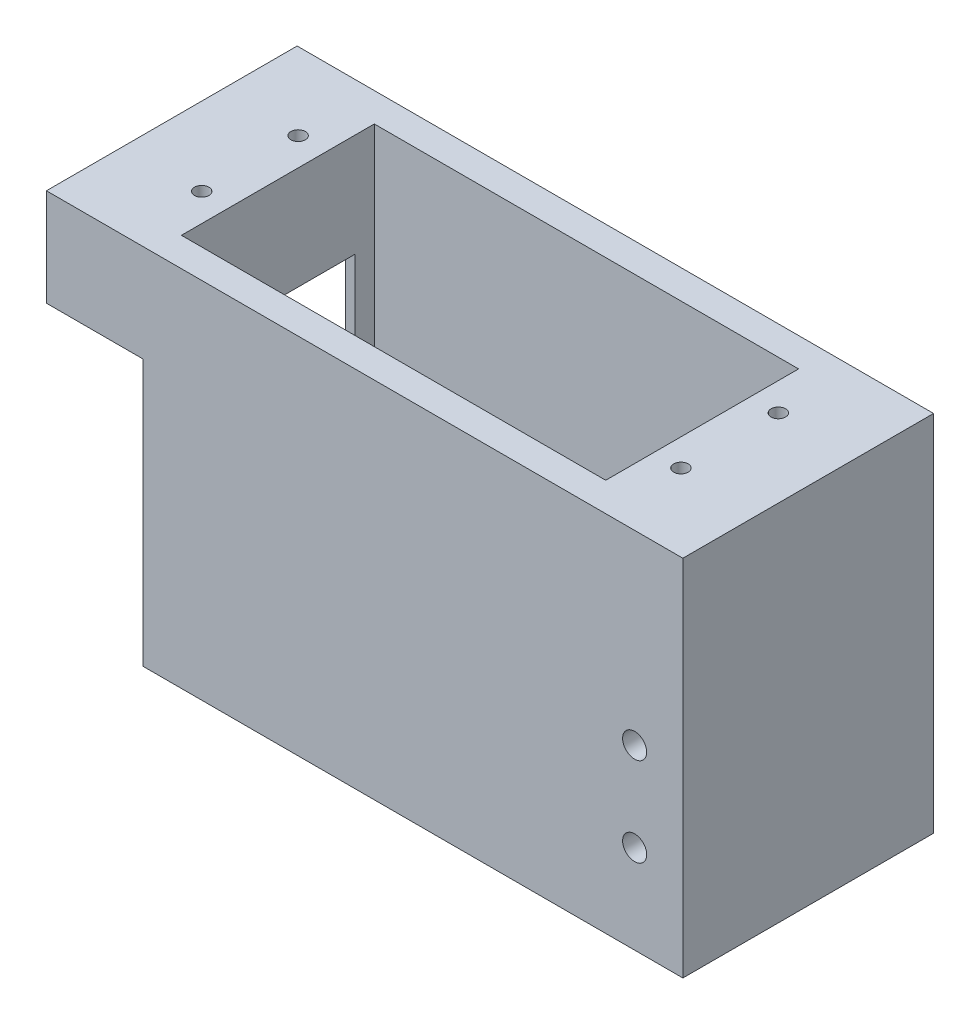
ISO-10303-21;
HEADER;
FILE_DESCRIPTION(('STEP AP214'),'2;1');
FILE_NAME('part.step','',(''),(''),'','','');
FILE_SCHEMA(('AUTOMOTIVE_DESIGN { 1 0 10303 214 1 1 1 1 }'));
ENDSEC;
DATA;
#1=APPLICATION_CONTEXT('core data for automotive mechanical design processes');
#2=APPLICATION_PROTOCOL_DEFINITION('international standard','automotive_design',2000,#1);
#3=PRODUCT_CONTEXT('',#1,'mechanical');
#4=PRODUCT('Part','Part','',(#3));
#5=PRODUCT_RELATED_PRODUCT_CATEGORY('part','',(#4));
#6=PRODUCT_DEFINITION_FORMATION('','',#4);
#7=PRODUCT_DEFINITION_CONTEXT('part definition',#1,'design');
#8=PRODUCT_DEFINITION('design','',#6,#7);
#9=PRODUCT_DEFINITION_SHAPE('','',#8);
#10=(LENGTH_UNIT() NAMED_UNIT(*) SI_UNIT(.MILLI.,.METRE.));
#11=(NAMED_UNIT(*) PLANE_ANGLE_UNIT() SI_UNIT($,.RADIAN.));
#12=(NAMED_UNIT(*) SI_UNIT($,.STERADIAN.) SOLID_ANGLE_UNIT());
#13=UNCERTAINTY_MEASURE_WITH_UNIT(LENGTH_MEASURE(1.E-05),#10,'distance_accuracy_value','');
#14=(GEOMETRIC_REPRESENTATION_CONTEXT(3) GLOBAL_UNCERTAINTY_ASSIGNED_CONTEXT((#13)) GLOBAL_UNIT_ASSIGNED_CONTEXT((#10,
#11,#12)) REPRESENTATION_CONTEXT('',''));
#15=CARTESIAN_POINT('',(0.,0.,0.));
#16=DIRECTION('',(0.,0.,1.));
#17=DIRECTION('',(1.,0.,0.));
#18=AXIS2_PLACEMENT_3D('',#15,#16,#17);
#19=CARTESIAN_POINT('',(0.,27.6,0.));
#20=DIRECTION('',(1.,0.,0.));
#21=DIRECTION('',(0.,0.,-1.));
#22=AXIS2_PLACEMENT_3D('',#19,#20,#21);
#23=PLANE('',#22);
#24=DIRECTION('',(0.,0.,1.));
#25=VECTOR('',#24,1.);
#26=CARTESIAN_POINT('',(0.,12.,-21.));
#27=LINE('',#26,#25);
#28=CARTESIAN_POINT('',(0.,12.,-21.));
#29=VERTEX_POINT('',#28);
#30=CARTESIAN_POINT('',(0.,12.,-5.));
#31=VERTEX_POINT('',#30);
#32=EDGE_CURVE('E239',#29,#31,#27,.T.);
#33=ORIENTED_EDGE('',*,*,#32,.F.);
#34=DIRECTION('',(0.,-1.,0.));
#35=VECTOR('',#34,1.);
#36=CARTESIAN_POINT('',(0.,27.,-21.));
#37=LINE('',#36,#35);
#38=CARTESIAN_POINT('',(0.,27.,-21.));
#39=VERTEX_POINT('',#38);
#40=EDGE_CURVE('E282',#39,#29,#37,.T.);
#41=ORIENTED_EDGE('',*,*,#40,.F.);
#42=DIRECTION('',(0.,0.,1.));
#43=VECTOR('',#42,1.);
#44=CARTESIAN_POINT('',(0.,27.,-21.));
#45=LINE('',#44,#43);
#46=CARTESIAN_POINT('',(0.,27.,-5.));
#47=VERTEX_POINT('',#46);
#48=EDGE_CURVE('E284',#39,#47,#45,.T.);
#49=ORIENTED_EDGE('',*,*,#48,.T.);
#50=DIRECTION('',(0.,-1.,0.));
#51=VECTOR('',#50,1.);
#52=CARTESIAN_POINT('',(0.,27.,-5.));
#53=LINE('',#52,#51);
#54=EDGE_CURVE('E291',#47,#31,#53,.T.);
#55=ORIENTED_EDGE('',*,*,#54,.T.);
#56=EDGE_LOOP('',(#33,#41,#49,#55));
#57=FACE_BOUND('',#56,.T.);
#58=DIRECTION('',(0.,0.,1.));
#59=VECTOR('',#58,1.);
#60=CARTESIAN_POINT('',(0.,0.,0.));
#61=LINE('',#60,#59);
#62=CARTESIAN_POINT('',(0.,0.,-26.));
#63=VERTEX_POINT('',#62);
#64=CARTESIAN_POINT('',(0.,0.,0.));
#65=VERTEX_POINT('',#64);
#66=EDGE_CURVE('E243',#63,#65,#61,.T.);
#67=ORIENTED_EDGE('',*,*,#66,.T.);
#68=DIRECTION('',(0.,-1.,0.));
#69=VECTOR('',#68,1.);
#70=CARTESIAN_POINT('',(0.,27.6,0.));
#71=LINE('',#70,#69);
#72=CARTESIAN_POINT('',(0.,27.6,0.));
#73=VERTEX_POINT('',#72);
#74=EDGE_CURVE('E246',#73,#65,#71,.T.);
#75=ORIENTED_EDGE('',*,*,#74,.F.);
#76=DIRECTION('',(0.,0.,1.));
#77=VECTOR('',#76,1.);
#78=CARTESIAN_POINT('',(0.,27.6,0.));
#79=LINE('',#78,#77);
#80=CARTESIAN_POINT('',(0.,27.6,-26.));
#81=VERTEX_POINT('',#80);
#82=EDGE_CURVE('E262',#81,#73,#79,.T.);
#83=ORIENTED_EDGE('',*,*,#82,.F.);
#84=DIRECTION('',(0.,-1.,0.));
#85=VECTOR('',#84,1.);
#86=CARTESIAN_POINT('',(0.,27.6,-26.));
#87=LINE('',#86,#85);
#88=EDGE_CURVE('E248',#81,#63,#87,.T.);
#89=ORIENTED_EDGE('',*,*,#88,.T.);
#90=EDGE_LOOP('',(#67,#75,#83,#89));
#91=FACE_BOUND('',#90,.T.);
#92=ADVANCED_FACE('F45',(#57,#91),#23,.F.);
#93=CARTESIAN_POINT('',(0.,27.6,0.));
#94=DIRECTION('',(0.,0.,-1.));
#95=DIRECTION('',(-1.,0.,0.));
#96=AXIS2_PLACEMENT_3D('',#93,#94,#95);
#97=PLANE('',#96);
#98=CARTESIAN_POINT('',(51.,18.4,0.));
#99=DIRECTION('',(0.,0.,1.));
#100=DIRECTION('',(1.,0.,0.));
#101=AXIS2_PLACEMENT_3D('',#98,#99,#100);
#102=CIRCLE('',#101,1.24999999999999);
#103=CARTESIAN_POINT('',(52.25,18.4,0.));
#104=VERTEX_POINT('',#103);
#105=EDGE_CURVE('E186',#104,#104,#102,.T.);
#106=ORIENTED_EDGE('',*,*,#105,.F.);
#107=EDGE_LOOP('',(#106));
#108=FACE_BOUND('',#107,.T.);
#109=CARTESIAN_POINT('',(51.,9.2,0.));
#110=DIRECTION('',(0.,0.,1.));
#111=DIRECTION('',(1.,0.,0.));
#112=AXIS2_PLACEMENT_3D('',#109,#110,#111);
#113=CIRCLE('',#112,1.24999999999999);
#114=CARTESIAN_POINT('',(52.25,9.2,0.));
#115=VERTEX_POINT('',#114);
#116=EDGE_CURVE('E392',#115,#115,#113,.T.);
#117=ORIENTED_EDGE('',*,*,#116,.F.);
#118=EDGE_LOOP('',(#117));
#119=FACE_BOUND('',#118,.T.);
#120=DIRECTION('',(1.,0.,0.));
#121=VECTOR('',#120,1.);
#122=CARTESIAN_POINT('',(0.,0.,0.));
#123=LINE('',#122,#121);
#124=CARTESIAN_POINT('',(56.,0.,0.));
#125=VERTEX_POINT('',#124);
#126=EDGE_CURVE('E251',#65,#125,#123,.T.);
#127=ORIENTED_EDGE('',*,*,#126,.T.);
#128=DIRECTION('',(0.,-1.,0.));
#129=VECTOR('',#128,1.);
#130=CARTESIAN_POINT('',(56.,37.7,0.));
#131=LINE('',#130,#129);
#132=CARTESIAN_POINT('',(56.,37.7,0.));
#133=VERTEX_POINT('',#132);
#134=EDGE_CURVE('E259',#133,#125,#131,.T.);
#135=ORIENTED_EDGE('',*,*,#134,.F.);
#136=DIRECTION('',(1.,0.,0.));
#137=VECTOR('',#136,1.);
#138=CARTESIAN_POINT('',(-10.,37.7,0.));
#139=LINE('',#138,#137);
#140=CARTESIAN_POINT('',(-10.,37.7,0.));
#141=VERTEX_POINT('',#140);
#142=EDGE_CURVE('E345',#141,#133,#139,.T.);
#143=ORIENTED_EDGE('',*,*,#142,.F.);
#144=DIRECTION('',(0.,-1.,0.));
#145=VECTOR('',#144,1.);
#146=CARTESIAN_POINT('',(-10.,37.7,0.));
#147=LINE('',#146,#145);
#148=CARTESIAN_POINT('',(-10.,27.6,0.));
#149=VERTEX_POINT('',#148);
#150=EDGE_CURVE('E252',#141,#149,#147,.T.);
#151=ORIENTED_EDGE('',*,*,#150,.T.);
#152=DIRECTION('',(1.,0.,0.));
#153=VECTOR('',#152,1.);
#154=CARTESIAN_POINT('',(-10.,27.6,0.));
#155=LINE('',#154,#153);
#156=EDGE_CURVE('E359',#149,#73,#155,.T.);
#157=ORIENTED_EDGE('',*,*,#156,.T.);
#158=ORIENTED_EDGE('',*,*,#74,.T.);
#159=EDGE_LOOP('',(#127,#135,#143,#151,#157,#158));
#160=FACE_BOUND('',#159,.T.);
#161=ADVANCED_FACE('F225',(#108,#119,#160),#97,.F.);
#162=CARTESIAN_POINT('',(0.,27.6,-26.));
#163=DIRECTION('',(0.,0.,1.));
#164=DIRECTION('',(1.,0.,0.));
#165=AXIS2_PLACEMENT_3D('',#162,#163,#164);
#166=PLANE('',#165);
#167=CARTESIAN_POINT('',(51.,18.4,-26.));
#168=DIRECTION('',(0.,0.,1.));
#169=DIRECTION('',(1.,0.,0.));
#170=AXIS2_PLACEMENT_3D('',#167,#168,#169);
#171=CIRCLE('',#170,1.24999999999999);
#172=CARTESIAN_POINT('',(52.25,18.4,-26.));
#173=VERTEX_POINT('',#172);
#174=EDGE_CURVE('E543',#173,#173,#171,.T.);
#175=ORIENTED_EDGE('',*,*,#174,.T.);
#176=EDGE_LOOP('',(#175));
#177=FACE_BOUND('',#176,.T.);
#178=CARTESIAN_POINT('',(51.,9.2,-26.));
#179=DIRECTION('',(0.,0.,1.));
#180=DIRECTION('',(1.,0.,0.));
#181=AXIS2_PLACEMENT_3D('',#178,#179,#180);
#182=CIRCLE('',#181,1.24999999999999);
#183=CARTESIAN_POINT('',(52.25,9.2,-26.));
#184=VERTEX_POINT('',#183);
#185=EDGE_CURVE('E384',#184,#184,#182,.T.);
#186=ORIENTED_EDGE('',*,*,#185,.T.);
#187=EDGE_LOOP('',(#186));
#188=FACE_BOUND('',#187,.T.);
#189=DIRECTION('',(0.,-1.,0.));
#190=VECTOR('',#189,1.);
#191=CARTESIAN_POINT('',(56.,37.7,-26.));
#192=LINE('',#191,#190);
#193=CARTESIAN_POINT('',(56.,37.7,-26.));
#194=VERTEX_POINT('',#193);
#195=CARTESIAN_POINT('',(56.,0.,-26.));
#196=VERTEX_POINT('',#195);
#197=EDGE_CURVE('E367',#194,#196,#192,.T.);
#198=ORIENTED_EDGE('',*,*,#197,.T.);
#199=DIRECTION('',(-1.,0.,0.));
#200=VECTOR('',#199,1.);
#201=CARTESIAN_POINT('',(0.,0.,-26.));
#202=LINE('',#201,#200);
#203=EDGE_CURVE('E256',#196,#63,#202,.T.);
#204=ORIENTED_EDGE('',*,*,#203,.T.);
#205=ORIENTED_EDGE('',*,*,#88,.F.);
#206=DIRECTION('',(-1.,0.,0.));
#207=VECTOR('',#206,1.);
#208=CARTESIAN_POINT('',(-10.,27.6,-26.));
#209=LINE('',#208,#207);
#210=CARTESIAN_POINT('',(-10.,27.6,-26.));
#211=VERTEX_POINT('',#210);
#212=EDGE_CURVE('E346',#81,#211,#209,.T.);
#213=ORIENTED_EDGE('',*,*,#212,.T.);
#214=DIRECTION('',(0.,-1.,0.));
#215=VECTOR('',#214,1.);
#216=CARTESIAN_POINT('',(-10.,37.7,-26.));
#217=LINE('',#216,#215);
#218=CARTESIAN_POINT('',(-10.,37.7,-26.));
#219=VERTEX_POINT('',#218);
#220=EDGE_CURVE('E355',#219,#211,#217,.T.);
#221=ORIENTED_EDGE('',*,*,#220,.F.);
#222=DIRECTION('',(-1.,0.,0.));
#223=VECTOR('',#222,1.);
#224=CARTESIAN_POINT('',(-10.,37.7,-26.));
#225=LINE('',#224,#223);
#226=EDGE_CURVE('E352',#194,#219,#225,.T.);
#227=ORIENTED_EDGE('',*,*,#226,.F.);
#228=EDGE_LOOP('',(#198,#204,#205,#213,#221,#227));
#229=FACE_BOUND('',#228,.T.);
#230=ADVANCED_FACE('F232',(#177,#188,#229),#166,.F.);
#231=CARTESIAN_POINT('',(0.,0.,0.));
#232=DIRECTION('',(0.,-1.,0.));
#233=DIRECTION('',(0.,0.,-1.));
#234=AXIS2_PLACEMENT_3D('',#231,#232,#233);
#235=PLANE('',#234);
#236=CARTESIAN_POINT('',(51.,0.,-13.));
#237=DIRECTION('',(0.,-1.,0.));
#238=DIRECTION('',(0.,0.,-1.));
#239=AXIS2_PLACEMENT_3D('',#236,#237,#238);
#240=CIRCLE('',#239,1.24999999999999);
#241=CARTESIAN_POINT('',(51.,0.,-14.25));
#242=VERTEX_POINT('',#241);
#243=EDGE_CURVE('E565',#242,#242,#240,.T.);
#244=ORIENTED_EDGE('',*,*,#243,.F.);
#245=EDGE_LOOP('',(#244));
#246=FACE_BOUND('',#245,.T.);
#247=CARTESIAN_POINT('',(13.05,0.,-13.));
#248=DIRECTION('',(0.,-1.,0.));
#249=DIRECTION('',(0.,0.,-1.));
#250=AXIS2_PLACEMENT_3D('',#247,#248,#249);
#251=CIRCLE('',#250,10.9);
#252=CARTESIAN_POINT('',(13.05,0.,-23.9));
#253=VERTEX_POINT('',#252);
#254=EDGE_CURVE('E431',#253,#253,#251,.T.);
#255=ORIENTED_EDGE('',*,*,#254,.F.);
#256=EDGE_LOOP('',(#255));
#257=FACE_BOUND('',#256,.T.);
#258=ORIENTED_EDGE('',*,*,#66,.F.);
#259=ORIENTED_EDGE('',*,*,#203,.F.);
#260=DIRECTION('',(0.,0.,-1.));
#261=VECTOR('',#260,1.);
#262=CARTESIAN_POINT('',(56.,0.,0.));
#263=LINE('',#262,#261);
#264=EDGE_CURVE('E380',#125,#196,#263,.T.);
#265=ORIENTED_EDGE('',*,*,#264,.F.);
#266=ORIENTED_EDGE('',*,*,#126,.F.);
#267=EDGE_LOOP('',(#258,#259,#265,#266));
#268=FACE_BOUND('',#267,.T.);
#269=ADVANCED_FACE('F381',(#246,#257,#268),#235,.T.);
#270=CARTESIAN_POINT('',(0.,27.6,0.));
#271=DIRECTION('',(0.,1.,0.));
#272=DIRECTION('',(0.,0.,1.));
#273=AXIS2_PLACEMENT_3D('',#270,#271,#272);
#274=PLANE('',#273);
#275=ORIENTED_EDGE('',*,*,#212,.F.);
#276=ORIENTED_EDGE('',*,*,#82,.T.);
#277=ORIENTED_EDGE('',*,*,#156,.F.);
#278=DIRECTION('',(0.,0.,1.));
#279=VECTOR('',#278,1.);
#280=CARTESIAN_POINT('',(-10.,27.6,-26.));
#281=LINE('',#280,#279);
#282=EDGE_CURVE('E340',#211,#149,#281,.T.);
#283=ORIENTED_EDGE('',*,*,#282,.F.);
#284=EDGE_LOOP('',(#275,#276,#277,#283));
#285=FACE_BOUND('',#284,.T.);
#286=ADVANCED_FACE('F526',(#285),#274,.F.);
#287=CARTESIAN_POINT('',(-10.,37.7,-26.));
#288=DIRECTION('',(1.,0.,0.));
#289=DIRECTION('',(0.,0.,-1.));
#290=AXIS2_PLACEMENT_3D('',#287,#288,#289);
#291=PLANE('',#290);
#292=ORIENTED_EDGE('',*,*,#282,.T.);
#293=ORIENTED_EDGE('',*,*,#150,.F.);
#294=DIRECTION('',(0.,0.,1.));
#295=VECTOR('',#294,1.);
#296=CARTESIAN_POINT('',(-10.,37.7,-26.));
#297=LINE('',#296,#295);
#298=EDGE_CURVE('E341',#219,#141,#297,.T.);
#299=ORIENTED_EDGE('',*,*,#298,.F.);
#300=ORIENTED_EDGE('',*,*,#220,.T.);
#301=EDGE_LOOP('',(#292,#293,#299,#300));
#302=FACE_BOUND('',#301,.T.);
#303=ADVANCED_FACE('F529',(#302),#291,.F.);
#304=CARTESIAN_POINT('',(56.,37.7,-26.));
#305=DIRECTION('',(-1.,0.,0.));
#306=DIRECTION('',(0.,0.,1.));
#307=AXIS2_PLACEMENT_3D('',#304,#305,#306);
#308=PLANE('',#307);
#309=ORIENTED_EDGE('',*,*,#134,.T.);
#310=ORIENTED_EDGE('',*,*,#264,.T.);
#311=ORIENTED_EDGE('',*,*,#197,.F.);
#312=DIRECTION('',(0.,0.,-1.));
#313=VECTOR('',#312,1.);
#314=CARTESIAN_POINT('',(56.,37.7,-26.));
#315=LINE('',#314,#313);
#316=EDGE_CURVE('E349',#133,#194,#315,.T.);
#317=ORIENTED_EDGE('',*,*,#316,.F.);
#318=EDGE_LOOP('',(#309,#310,#311,#317));
#319=FACE_BOUND('',#318,.T.);
#320=ADVANCED_FACE('F378',(#319),#308,.F.);
#321=CARTESIAN_POINT('',(0.,37.7,0.));
#322=DIRECTION('',(0.,1.,0.));
#323=DIRECTION('',(0.,0.,1.));
#324=AXIS2_PLACEMENT_3D('',#321,#322,#323);
#325=PLANE('',#324);
#326=DIRECTION('',(0.,0.,1.));
#327=VECTOR('',#326,1.);
#328=CARTESIAN_POINT('',(0.999999999999993,37.7,-23.));
#329=LINE('',#328,#327);
#330=CARTESIAN_POINT('',(0.999999999999993,37.7,-23.));
#331=VERTEX_POINT('',#330);
#332=CARTESIAN_POINT('',(0.999999999999992,37.7,-2.99999999999999));
#333=VERTEX_POINT('',#332);
#334=EDGE_CURVE('E383',#331,#333,#329,.T.);
#335=ORIENTED_EDGE('',*,*,#334,.F.);
#336=DIRECTION('',(-1.,0.,0.));
#337=VECTOR('',#336,1.);
#338=CARTESIAN_POINT('',(43.,37.7,-23.));
#339=LINE('',#338,#337);
#340=CARTESIAN_POINT('',(45.,37.7,-23.));
#341=VERTEX_POINT('',#340);
#342=EDGE_CURVE('E334',#341,#331,#339,.T.);
#343=ORIENTED_EDGE('',*,*,#342,.F.);
#344=DIRECTION('',(0.,0.,-1.));
#345=VECTOR('',#344,1.);
#346=CARTESIAN_POINT('',(45.,37.7,-23.));
#347=LINE('',#346,#345);
#348=CARTESIAN_POINT('',(45.,37.7,-2.99999999999999));
#349=VERTEX_POINT('',#348);
#350=EDGE_CURVE('E389',#349,#341,#347,.T.);
#351=ORIENTED_EDGE('',*,*,#350,.F.);
#352=DIRECTION('',(-1.,0.,0.));
#353=VECTOR('',#352,1.);
#354=CARTESIAN_POINT('',(43.,37.7,-3.));
#355=LINE('',#354,#353);
#356=EDGE_CURVE('E337',#349,#333,#355,.T.);
#357=ORIENTED_EDGE('',*,*,#356,.T.);
#358=EDGE_LOOP('',(#335,#343,#351,#357));
#359=FACE_BOUND('',#358,.T.);
#360=CARTESIAN_POINT('',(-1.90000000000001,37.7,-18.));
#361=DIRECTION('',(0.,1.,0.));
#362=DIRECTION('',(0.,0.,1.));
#363=AXIS2_PLACEMENT_3D('',#360,#361,#362);
#364=CIRCLE('',#363,0.749999999999989);
#365=CARTESIAN_POINT('',(-1.90000000000001,37.7,-17.25));
#366=VERTEX_POINT('',#365);
#367=EDGE_CURVE('E302',#366,#366,#364,.T.);
#368=ORIENTED_EDGE('',*,*,#367,.F.);
#369=EDGE_LOOP('',(#368));
#370=FACE_BOUND('',#369,.T.);
#371=CARTESIAN_POINT('',(-1.90000000000001,37.7,-8.));
#372=DIRECTION('',(0.,1.,0.));
#373=DIRECTION('',(0.,0.,1.));
#374=AXIS2_PLACEMENT_3D('',#371,#372,#373);
#375=CIRCLE('',#374,0.749999999999989);
#376=CARTESIAN_POINT('',(-1.90000000000001,37.7,-7.25000000000001));
#377=VERTEX_POINT('',#376);
#378=EDGE_CURVE('E310',#377,#377,#375,.T.);
#379=ORIENTED_EDGE('',*,*,#378,.F.);
#380=EDGE_LOOP('',(#379));
#381=FACE_BOUND('',#380,.T.);
#382=CARTESIAN_POINT('',(47.8,37.7,-8.));
#383=DIRECTION('',(0.,1.,0.));
#384=DIRECTION('',(0.,0.,1.));
#385=AXIS2_PLACEMENT_3D('',#382,#383,#384);
#386=CIRCLE('',#385,0.749999999999987);
#387=CARTESIAN_POINT('',(47.8,37.7,-7.25000000000001));
#388=VERTEX_POINT('',#387);
#389=EDGE_CURVE('E318',#388,#388,#386,.T.);
#390=ORIENTED_EDGE('',*,*,#389,.F.);
#391=EDGE_LOOP('',(#390));
#392=FACE_BOUND('',#391,.T.);
#393=CARTESIAN_POINT('',(47.9,37.7,-18.));
#394=DIRECTION('',(0.,1.,0.));
#395=DIRECTION('',(0.,0.,1.));
#396=AXIS2_PLACEMENT_3D('',#393,#394,#395);
#397=CIRCLE('',#396,0.749999999999987);
#398=CARTESIAN_POINT('',(47.9,37.7,-17.25));
#399=VERTEX_POINT('',#398);
#400=EDGE_CURVE('E326',#399,#399,#397,.T.);
#401=ORIENTED_EDGE('',*,*,#400,.F.);
#402=EDGE_LOOP('',(#401));
#403=FACE_BOUND('',#402,.T.);
#404=ORIENTED_EDGE('',*,*,#298,.T.);
#405=ORIENTED_EDGE('',*,*,#142,.T.);
#406=ORIENTED_EDGE('',*,*,#316,.T.);
#407=ORIENTED_EDGE('',*,*,#226,.T.);
#408=EDGE_LOOP('',(#404,#405,#406,#407));
#409=FACE_BOUND('',#408,.T.);
#410=ADVANCED_FACE('F518',(#359,#370,#381,#392,#403,#409),#325,.T.);
#411=CARTESIAN_POINT('',(43.,12.2,-3.));
#412=DIRECTION('',(0.,0.,-1.));
#413=DIRECTION('',(-1.,0.,0.));
#414=AXIS2_PLACEMENT_3D('',#411,#412,#413);
#415=PLANE('',#414);
#416=ORIENTED_EDGE('',*,*,#356,.F.);
#417=DIRECTION('',(0.,1.,0.));
#418=VECTOR('',#417,1.);
#419=CARTESIAN_POINT('',(45.,9.2,-2.99999999999999));
#420=LINE('',#419,#418);
#421=CARTESIAN_POINT('',(45.,9.2,-2.99999999999999));
#422=VERTEX_POINT('',#421);
#423=EDGE_CURVE('E417',#422,#349,#420,.T.);
#424=ORIENTED_EDGE('',*,*,#423,.F.);
#425=DIRECTION('',(1.,0.,0.));
#426=VECTOR('',#425,1.);
#427=CARTESIAN_POINT('',(2.99999999999999,9.20000000000001,-3.));
#428=LINE('',#427,#426);
#429=CARTESIAN_POINT('',(0.999999999999992,9.2,-2.99999999999999));
#430=VERTEX_POINT('',#429);
#431=EDGE_CURVE('E295',#430,#422,#428,.T.);
#432=ORIENTED_EDGE('',*,*,#431,.F.);
#433=DIRECTION('',(0.,1.,0.));
#434=VECTOR('',#433,1.);
#435=CARTESIAN_POINT('',(0.999999999999992,9.2,-2.99999999999999));
#436=LINE('',#435,#434);
#437=EDGE_CURVE('E403',#430,#333,#436,.T.);
#438=ORIENTED_EDGE('',*,*,#437,.T.);
#439=EDGE_LOOP('',(#416,#424,#432,#438));
#440=FACE_BOUND('',#439,.T.);
#441=ADVANCED_FACE('F515',(#440),#415,.T.);
#442=CARTESIAN_POINT('',(43.,12.2,-23.));
#443=DIRECTION('',(0.,0.,-1.));
#444=DIRECTION('',(-1.,0.,0.));
#445=AXIS2_PLACEMENT_3D('',#442,#443,#444);
#446=PLANE('',#445);
#447=ORIENTED_EDGE('',*,*,#342,.T.);
#448=DIRECTION('',(0.,1.,0.));
#449=VECTOR('',#448,1.);
#450=CARTESIAN_POINT('',(0.999999999999993,9.2,-23.));
#451=LINE('',#450,#449);
#452=CARTESIAN_POINT('',(0.999999999999993,9.2,-23.));
#453=VERTEX_POINT('',#452);
#454=EDGE_CURVE('E408',#453,#331,#451,.T.);
#455=ORIENTED_EDGE('',*,*,#454,.F.);
#456=DIRECTION('',(1.,0.,0.));
#457=VECTOR('',#456,1.);
#458=CARTESIAN_POINT('',(2.99999999999999,9.20000000000001,-23.));
#459=LINE('',#458,#457);
#460=CARTESIAN_POINT('',(45.,9.2,-23.));
#461=VERTEX_POINT('',#460);
#462=EDGE_CURVE('E298',#453,#461,#459,.T.);
#463=ORIENTED_EDGE('',*,*,#462,.T.);
#464=DIRECTION('',(0.,1.,0.));
#465=VECTOR('',#464,1.);
#466=CARTESIAN_POINT('',(45.,9.2,-23.));
#467=LINE('',#466,#465);
#468=EDGE_CURVE('E413',#461,#341,#467,.T.);
#469=ORIENTED_EDGE('',*,*,#468,.T.);
#470=EDGE_LOOP('',(#447,#455,#463,#469));
#471=FACE_BOUND('',#470,.T.);
#472=ADVANCED_FACE('F513',(#471),#446,.F.);
#473=CARTESIAN_POINT('',(47.9,28.7,-18.));
#474=DIRECTION('',(0.,1.,0.));
#475=DIRECTION('',(0.,0.,1.));
#476=AXIS2_PLACEMENT_3D('',#473,#474,#475);
#477=CONICAL_SURFACE('',#476,0.749999999999994,1.02974425867665);
#478=CARTESIAN_POINT('',(47.9,28.2493545357293,-18.));
#479=VERTEX_POINT('',#478);
#480=VERTEX_LOOP('',#479);
#481=FACE_BOUND('',#480,.T.);
#482=CARTESIAN_POINT('',(47.9,28.7,-18.));
#483=DIRECTION('',(0.,1.,0.));
#484=DIRECTION('',(0.,0.,1.));
#485=AXIS2_PLACEMENT_3D('',#482,#483,#484);
#486=CIRCLE('',#485,0.749999999999994);
#487=CARTESIAN_POINT('',(47.9,28.7,-17.25));
#488=VERTEX_POINT('',#487);
#489=EDGE_CURVE('E330',#488,#488,#486,.T.);
#490=ORIENTED_EDGE('',*,*,#489,.T.);
#491=EDGE_LOOP('',(#490));
#492=FACE_BOUND('',#491,.T.);
#493=ADVANCED_FACE('F509',(#481,#492),#477,.F.);
#494=CARTESIAN_POINT('',(47.9,37.7,-18.));
#495=DIRECTION('',(0.,1.,0.));
#496=DIRECTION('',(0.,0.,1.));
#497=AXIS2_PLACEMENT_3D('',#494,#495,#496);
#498=CYLINDRICAL_SURFACE('',#497,0.74999999999999);
#499=ORIENTED_EDGE('',*,*,#489,.F.);
#500=EDGE_LOOP('',(#499));
#501=FACE_BOUND('',#500,.T.);
#502=ORIENTED_EDGE('',*,*,#400,.T.);
#503=EDGE_LOOP('',(#502));
#504=FACE_BOUND('',#503,.T.);
#505=ADVANCED_FACE('F505',(#501,#504),#498,.F.);
#506=CARTESIAN_POINT('',(47.8,28.7,-8.));
#507=DIRECTION('',(0.,1.,0.));
#508=DIRECTION('',(0.,0.,1.));
#509=AXIS2_PLACEMENT_3D('',#506,#507,#508);
#510=CONICAL_SURFACE('',#509,0.749999999999994,1.02974425867665);
#511=CARTESIAN_POINT('',(47.8,28.2493545357293,-8.));
#512=VERTEX_POINT('',#511);
#513=VERTEX_LOOP('',#512);
#514=FACE_BOUND('',#513,.T.);
#515=CARTESIAN_POINT('',(47.8,28.7,-8.));
#516=DIRECTION('',(0.,1.,0.));
#517=DIRECTION('',(0.,0.,1.));
#518=AXIS2_PLACEMENT_3D('',#515,#516,#517);
#519=CIRCLE('',#518,0.749999999999994);
#520=CARTESIAN_POINT('',(47.8,28.7,-7.25000000000001));
#521=VERTEX_POINT('',#520);
#522=EDGE_CURVE('E322',#521,#521,#519,.T.);
#523=ORIENTED_EDGE('',*,*,#522,.T.);
#524=EDGE_LOOP('',(#523));
#525=FACE_BOUND('',#524,.T.);
#526=ADVANCED_FACE('F501',(#514,#525),#510,.F.);
#527=CARTESIAN_POINT('',(47.8,37.7,-8.));
#528=DIRECTION('',(0.,1.,0.));
#529=DIRECTION('',(0.,0.,1.));
#530=AXIS2_PLACEMENT_3D('',#527,#528,#529);
#531=CYLINDRICAL_SURFACE('',#530,0.74999999999999);
#532=ORIENTED_EDGE('',*,*,#522,.F.);
#533=EDGE_LOOP('',(#532));
#534=FACE_BOUND('',#533,.T.);
#535=ORIENTED_EDGE('',*,*,#389,.T.);
#536=EDGE_LOOP('',(#535));
#537=FACE_BOUND('',#536,.T.);
#538=ADVANCED_FACE('F497',(#534,#537),#531,.F.);
#539=CARTESIAN_POINT('',(-1.90000000000001,28.7,-8.));
#540=DIRECTION('',(0.,1.,0.));
#541=DIRECTION('',(0.,0.,1.));
#542=AXIS2_PLACEMENT_3D('',#539,#540,#541);
#543=CONICAL_SURFACE('',#542,0.749999999999996,1.02974425867665);
#544=CARTESIAN_POINT('',(-1.90000000000001,28.2493545357293,-8.));
#545=VERTEX_POINT('',#544);
#546=VERTEX_LOOP('',#545);
#547=FACE_BOUND('',#546,.T.);
#548=CARTESIAN_POINT('',(-1.90000000000001,28.7,-8.));
#549=DIRECTION('',(0.,1.,0.));
#550=DIRECTION('',(0.,0.,1.));
#551=AXIS2_PLACEMENT_3D('',#548,#549,#550);
#552=CIRCLE('',#551,0.749999999999996);
#553=CARTESIAN_POINT('',(-1.90000000000001,28.7,-7.25));
#554=VERTEX_POINT('',#553);
#555=EDGE_CURVE('E314',#554,#554,#552,.T.);
#556=ORIENTED_EDGE('',*,*,#555,.T.);
#557=EDGE_LOOP('',(#556));
#558=FACE_BOUND('',#557,.T.);
#559=ADVANCED_FACE('F493',(#547,#558),#543,.F.);
#560=CARTESIAN_POINT('',(-1.90000000000001,37.7,-8.));
#561=DIRECTION('',(0.,1.,0.));
#562=DIRECTION('',(0.,0.,1.));
#563=AXIS2_PLACEMENT_3D('',#560,#561,#562);
#564=CYLINDRICAL_SURFACE('',#563,0.749999999999992);
#565=ORIENTED_EDGE('',*,*,#555,.F.);
#566=EDGE_LOOP('',(#565));
#567=FACE_BOUND('',#566,.T.);
#568=ORIENTED_EDGE('',*,*,#378,.T.);
#569=EDGE_LOOP('',(#568));
#570=FACE_BOUND('',#569,.T.);
#571=ADVANCED_FACE('F489',(#567,#570),#564,.F.);
#572=CARTESIAN_POINT('',(-1.90000000000001,28.7,-18.));
#573=DIRECTION('',(0.,1.,0.));
#574=DIRECTION('',(0.,0.,1.));
#575=AXIS2_PLACEMENT_3D('',#572,#573,#574);
#576=CONICAL_SURFACE('',#575,0.749999999999996,1.02974425867665);
#577=CARTESIAN_POINT('',(-1.90000000000001,28.2493545357293,-18.));
#578=VERTEX_POINT('',#577);
#579=VERTEX_LOOP('',#578);
#580=FACE_BOUND('',#579,.T.);
#581=CARTESIAN_POINT('',(-1.90000000000001,28.7,-18.));
#582=DIRECTION('',(0.,1.,0.));
#583=DIRECTION('',(0.,0.,1.));
#584=AXIS2_PLACEMENT_3D('',#581,#582,#583);
#585=CIRCLE('',#584,0.749999999999996);
#586=CARTESIAN_POINT('',(-1.90000000000001,28.7,-17.25));
#587=VERTEX_POINT('',#586);
#588=EDGE_CURVE('E306',#587,#587,#585,.T.);
#589=ORIENTED_EDGE('',*,*,#588,.T.);
#590=EDGE_LOOP('',(#589));
#591=FACE_BOUND('',#590,.T.);
#592=ADVANCED_FACE('F485',(#580,#591),#576,.F.);
#593=CARTESIAN_POINT('',(-1.90000000000001,37.7,-18.));
#594=DIRECTION('',(0.,1.,0.));
#595=DIRECTION('',(0.,0.,1.));
#596=AXIS2_PLACEMENT_3D('',#593,#594,#595);
#597=CYLINDRICAL_SURFACE('',#596,0.749999999999992);
#598=ORIENTED_EDGE('',*,*,#588,.F.);
#599=EDGE_LOOP('',(#598));
#600=FACE_BOUND('',#599,.T.);
#601=ORIENTED_EDGE('',*,*,#367,.T.);
#602=EDGE_LOOP('',(#601));
#603=FACE_BOUND('',#602,.T.);
#604=ADVANCED_FACE('F482',(#600,#603),#597,.F.);
#605=CARTESIAN_POINT('',(0.,9.20000000000001,0.));
#606=DIRECTION('',(0.,-1.,0.));
#607=DIRECTION('',(0.,0.,-1.));
#608=AXIS2_PLACEMENT_3D('',#605,#606,#607);
#609=PLANE('',#608);
#610=ORIENTED_EDGE('',*,*,#431,.T.);
#611=DIRECTION('',(0.,0.,-1.));
#612=VECTOR('',#611,1.);
#613=CARTESIAN_POINT('',(45.,9.2,-23.));
#614=LINE('',#613,#612);
#615=EDGE_CURVE('E400',#422,#461,#614,.T.);
#616=ORIENTED_EDGE('',*,*,#615,.T.);
#617=ORIENTED_EDGE('',*,*,#462,.F.);
#618=DIRECTION('',(0.,0.,1.));
#619=VECTOR('',#618,1.);
#620=CARTESIAN_POINT('',(0.999999999999993,9.2,-23.));
#621=LINE('',#620,#619);
#622=EDGE_CURVE('E396',#453,#430,#621,.T.);
#623=ORIENTED_EDGE('',*,*,#622,.T.);
#624=EDGE_LOOP('',(#610,#616,#617,#623));
#625=FACE_BOUND('',#624,.T.);
#626=ADVANCED_FACE('F479',(#625),#609,.F.);
#627=CARTESIAN_POINT('',(3.,27.,-21.));
#628=DIRECTION('',(0.,0.,-1.));
#629=DIRECTION('',(0.,1.,0.));
#630=AXIS2_PLACEMENT_3D('',#627,#628,#629);
#631=PLANE('',#630);
#632=DIRECTION('',(-1.,0.,0.));
#633=VECTOR('',#632,1.);
#634=CARTESIAN_POINT('',(3.,12.,-21.));
#635=LINE('',#634,#633);
#636=CARTESIAN_POINT('',(0.999999999999993,12.,-21.));
#637=VERTEX_POINT('',#636);
#638=EDGE_CURVE('E275',#637,#29,#635,.T.);
#639=ORIENTED_EDGE('',*,*,#638,.F.);
#640=DIRECTION('',(0.,1.,0.));
#641=VECTOR('',#640,1.);
#642=CARTESIAN_POINT('',(0.999999999999993,27.,-21.));
#643=LINE('',#642,#641);
#644=CARTESIAN_POINT('',(0.999999999999993,27.,-21.));
#645=VERTEX_POINT('',#644);
#646=EDGE_CURVE('E73',#637,#645,#643,.T.);
#647=ORIENTED_EDGE('',*,*,#646,.T.);
#648=DIRECTION('',(-1.,0.,0.));
#649=VECTOR('',#648,1.);
#650=CARTESIAN_POINT('',(3.,27.,-21.));
#651=LINE('',#650,#649);
#652=EDGE_CURVE('E299',#645,#39,#651,.T.);
#653=ORIENTED_EDGE('',*,*,#652,.T.);
#654=ORIENTED_EDGE('',*,*,#40,.T.);
#655=EDGE_LOOP('',(#639,#647,#653,#654));
#656=FACE_BOUND('',#655,.T.);
#657=ADVANCED_FACE('F280',(#656),#631,.F.);
#658=CARTESIAN_POINT('',(3.,27.,-21.));
#659=DIRECTION('',(0.,-1.,0.));
#660=DIRECTION('',(0.,0.,-1.));
#661=AXIS2_PLACEMENT_3D('',#658,#659,#660);
#662=PLANE('',#661);
#663=DIRECTION('',(0.,0.,-1.));
#664=VECTOR('',#663,1.);
#665=CARTESIAN_POINT('',(0.999999999999993,27.,-21.));
#666=LINE('',#665,#664);
#667=CARTESIAN_POINT('',(0.999999999999993,27.,-5.));
#668=VERTEX_POINT('',#667);
#669=EDGE_CURVE('E426',#668,#645,#666,.T.);
#670=ORIENTED_EDGE('',*,*,#669,.F.);
#671=DIRECTION('',(-1.,0.,0.));
#672=VECTOR('',#671,1.);
#673=CARTESIAN_POINT('',(3.,27.,-5.));
#674=LINE('',#673,#672);
#675=EDGE_CURVE('E288',#668,#47,#674,.T.);
#676=ORIENTED_EDGE('',*,*,#675,.T.);
#677=ORIENTED_EDGE('',*,*,#48,.F.);
#678=ORIENTED_EDGE('',*,*,#652,.F.);
#679=EDGE_LOOP('',(#670,#676,#677,#678));
#680=FACE_BOUND('',#679,.T.);
#681=ADVANCED_FACE('F452',(#680),#662,.T.);
#682=CARTESIAN_POINT('',(3.,27.,-5.));
#683=DIRECTION('',(0.,0.,-1.));
#684=DIRECTION('',(0.,1.,0.));
#685=AXIS2_PLACEMENT_3D('',#682,#683,#684);
#686=PLANE('',#685);
#687=DIRECTION('',(0.,1.,0.));
#688=VECTOR('',#687,1.);
#689=CARTESIAN_POINT('',(0.999999999999993,27.,-5.));
#690=LINE('',#689,#688);
#691=CARTESIAN_POINT('',(0.999999999999992,12.,-5.));
#692=VERTEX_POINT('',#691);
#693=EDGE_CURVE('E412',#692,#668,#690,.T.);
#694=ORIENTED_EDGE('',*,*,#693,.F.);
#695=DIRECTION('',(-1.,0.,0.));
#696=VECTOR('',#695,1.);
#697=CARTESIAN_POINT('',(3.,12.,-5.));
#698=LINE('',#697,#696);
#699=EDGE_CURVE('E277',#692,#31,#698,.T.);
#700=ORIENTED_EDGE('',*,*,#699,.T.);
#701=ORIENTED_EDGE('',*,*,#54,.F.);
#702=ORIENTED_EDGE('',*,*,#675,.F.);
#703=EDGE_LOOP('',(#694,#700,#701,#702));
#704=FACE_BOUND('',#703,.T.);
#705=ADVANCED_FACE('F454',(#704),#686,.T.);
#706=CARTESIAN_POINT('',(3.,12.,-21.));
#707=DIRECTION('',(0.,-1.,0.));
#708=DIRECTION('',(0.,0.,-1.));
#709=AXIS2_PLACEMENT_3D('',#706,#707,#708);
#710=PLANE('',#709);
#711=ORIENTED_EDGE('',*,*,#699,.F.);
#712=DIRECTION('',(0.,0.,-1.));
#713=VECTOR('',#712,1.);
#714=CARTESIAN_POINT('',(0.999999999999993,12.,-21.));
#715=LINE('',#714,#713);
#716=EDGE_CURVE('E201',#692,#637,#715,.T.);
#717=ORIENTED_EDGE('',*,*,#716,.T.);
#718=ORIENTED_EDGE('',*,*,#638,.T.);
#719=ORIENTED_EDGE('',*,*,#32,.T.);
#720=EDGE_LOOP('',(#711,#717,#718,#719));
#721=FACE_BOUND('',#720,.T.);
#722=ADVANCED_FACE('F274',(#721),#710,.F.);
#723=CARTESIAN_POINT('',(13.05,7.,-13.));
#724=DIRECTION('',(0.,-1.,0.));
#725=DIRECTION('',(0.,0.,-1.));
#726=AXIS2_PLACEMENT_3D('',#723,#724,#725);
#727=CYLINDRICAL_SURFACE('',#726,10.9);
#728=CARTESIAN_POINT('',(13.05,7.,-13.));
#729=DIRECTION('',(0.,-1.,0.));
#730=DIRECTION('',(0.,0.,-1.));
#731=AXIS2_PLACEMENT_3D('',#728,#729,#730);
#732=CIRCLE('',#731,10.9);
#733=CARTESIAN_POINT('',(13.05,7.,-23.9));
#734=VERTEX_POINT('',#733);
#735=EDGE_CURVE('E432',#734,#734,#732,.T.);
#736=ORIENTED_EDGE('',*,*,#735,.F.);
#737=EDGE_LOOP('',(#736));
#738=FACE_BOUND('',#737,.T.);
#739=ORIENTED_EDGE('',*,*,#254,.T.);
#740=EDGE_LOOP('',(#739));
#741=FACE_BOUND('',#740,.T.);
#742=ADVANCED_FACE('F466',(#738,#741),#727,.F.);
#743=CARTESIAN_POINT('',(13.05,7.,-13.));
#744=DIRECTION('',(0.,-1.,0.));
#745=DIRECTION('',(0.,0.,-1.));
#746=AXIS2_PLACEMENT_3D('',#743,#744,#745);
#747=PLANE('',#746);
#748=ORIENTED_EDGE('',*,*,#735,.T.);
#749=EDGE_LOOP('',(#748));
#750=FACE_BOUND('',#749,.T.);
#751=ADVANCED_FACE('F457',(#750),#747,.T.);
#752=CARTESIAN_POINT('',(0.999999999999993,9.2,-23.));
#753=DIRECTION('',(-1.,0.,0.));
#754=DIRECTION('',(0.,0.,1.));
#755=AXIS2_PLACEMENT_3D('',#752,#753,#754);
#756=PLANE('',#755);
#757=ORIENTED_EDGE('',*,*,#334,.T.);
#758=ORIENTED_EDGE('',*,*,#437,.F.);
#759=ORIENTED_EDGE('',*,*,#622,.F.);
#760=ORIENTED_EDGE('',*,*,#454,.T.);
#761=EDGE_LOOP('',(#757,#758,#759,#760));
#762=FACE_BOUND('',#761,.T.);
#763=ORIENTED_EDGE('',*,*,#716,.F.);
#764=ORIENTED_EDGE('',*,*,#693,.T.);
#765=ORIENTED_EDGE('',*,*,#669,.T.);
#766=ORIENTED_EDGE('',*,*,#646,.F.);
#767=EDGE_LOOP('',(#763,#764,#765,#766));
#768=FACE_BOUND('',#767,.T.);
#769=ADVANCED_FACE('F455',(#762,#768),#756,.F.);
#770=CARTESIAN_POINT('',(45.,9.2,-23.));
#771=DIRECTION('',(1.,0.,0.));
#772=DIRECTION('',(0.,0.,-1.));
#773=AXIS2_PLACEMENT_3D('',#770,#771,#772);
#774=PLANE('',#773);
#775=ORIENTED_EDGE('',*,*,#350,.T.);
#776=ORIENTED_EDGE('',*,*,#468,.F.);
#777=ORIENTED_EDGE('',*,*,#615,.F.);
#778=ORIENTED_EDGE('',*,*,#423,.T.);
#779=EDGE_LOOP('',(#775,#776,#777,#778));
#780=FACE_BOUND('',#779,.T.);
#781=ADVANCED_FACE('F221',(#780),#774,.F.);
#782=CARTESIAN_POINT('',(51.,9.2,0.));
#783=DIRECTION('',(0.,0.,1.));
#784=DIRECTION('',(1.,0.,0.));
#785=AXIS2_PLACEMENT_3D('',#782,#783,#784);
#786=CYLINDRICAL_SURFACE('',#785,1.24999999999999);
#787=CARTESIAN_POINT('',(51.,9.2,-13.));
#788=DIRECTION('',(0.,-0.707106781186547,0.707106781186547));
#789=DIRECTION('',(0.,0.707106781186547,0.707106781186547));
#790=AXIS2_PLACEMENT_3D('',#787,#788,#789);
#791=ELLIPSE('',#790,1.76776695296636,1.24999999999999);
#792=CARTESIAN_POINT('',(49.7661037320746,8.99999999999998,-13.1999999999998));
#793=VERTEX_POINT('',#792);
#794=CARTESIAN_POINT('',(52.2338962679253,9.,-13.2));
#795=VERTEX_POINT('',#794);
#796=EDGE_CURVE('E59',#793,#795,#791,.T.);
#797=ORIENTED_EDGE('',*,*,#796,.T.);
#798=CARTESIAN_POINT('',(52.2002197017089,8.85075414443443,-13.8970148915852));
#799=CARTESIAN_POINT('',(52.204161934417,8.86428986479588,-13.8540795263));
#800=CARTESIAN_POINT('',(52.2076952634883,8.87729709392252,-13.8109578779105));
#801=CARTESIAN_POINT('',(52.2140355720769,8.90204217999825,-13.7240638204089));
#802=CARTESIAN_POINT('',(52.2168387957152,8.91377329911932,-13.6802892253135));
#803=CARTESIAN_POINT('',(52.2261083214748,8.95480694269553,-13.5148525456843));
#804=CARTESIAN_POINT('',(52.2303510131614,8.97874513945185,-13.3915495005446));
#805=CARTESIAN_POINT('',(52.2339734522761,9.0003483025781,-13.2051221267444));
#806=CARTESIAN_POINT('',(52.234724968058,9.00516896357258,-13.1428342180197));
#807=CARTESIAN_POINT('',(52.23541988155,9.00962405068977,-13.018075701948));
#808=CARTESIAN_POINT('',(52.2353634654456,9.009259671689,-12.9556051400103));
#809=CARTESIAN_POINT('',(52.2342409696671,9.00207698277845,-12.8040325903875));
#810=CARTESIAN_POINT('',(52.2327503148258,8.99254541830586,-12.7150539399843));
#811=CARTESIAN_POINT('',(52.2289804654079,8.97163152807331,-12.582604926268));
#812=CARTESIAN_POINT('',(52.227463827208,8.96353562199649,-12.5385418209093));
#813=CARTESIAN_POINT('',(52.2238435318951,8.94545293534649,-12.4508260433874));
#814=CARTESIAN_POINT('',(52.2217398566798,8.93546609646637,-12.4071733839238));
#815=CARTESIAN_POINT('',(52.2124955236919,8.89455480776734,-12.2422184230709));
#816=CARTESIAN_POINT('',(52.2030974702114,8.85826012761157,-12.1223701193706));
#817=CARTESIAN_POINT('',(52.1776168128327,8.77871985779107,-11.8856332041859));
#818=CARTESIAN_POINT('',(52.1615238783708,8.73546358954264,-11.7687494642007));
#819=CARTESIAN_POINT('',(52.1212867413645,8.64533297039975,-11.5380366940448));
#820=CARTESIAN_POINT('',(52.0971573128571,8.5984653790889,-11.4242024696175));
#821=CARTESIAN_POINT('',(52.039237669643,8.50314468128374,-11.199821321083));
#822=CARTESIAN_POINT('',(52.0054620256371,8.45469406298902,-11.0892697145171));
#823=CARTESIAN_POINT('',(51.9488298053466,8.38579986694473,-10.9350961979943));
#824=CARTESIAN_POINT('',(51.9309172303347,8.36532625787777,-10.8896604179066));
#825=CARTESIAN_POINT('',(51.8926615878541,8.32453915764115,-10.7997727640527));
#826=CARTESIAN_POINT('',(51.8723192584616,8.30422561983588,-10.7553205963373));
#827=CARTESIAN_POINT('',(51.8506190399798,8.28405936391936,-10.7114430105189));
#828=B_SPLINE_CURVE_WITH_KNOTS('',3,(#798,#799,#800,#801,#802,#803,#804,#805,#806,#807,#808,
#809,#810,#811,#812,#813,#814,#815,#816,#817,#818,#819,#820,#821,#822,#823,#824,#825,#826,#827),
.UNSPECIFIED.,.F.,.F.,(4,2,2,2,2,2,2,2,2,2,2,2,2,2,4),(0.,0.135529101189556,0.271742216185722,
0.647412716207965,0.834654568672104,1.02185327252546,1.28971320680017,1.42415824765733,
1.55860743480495,1.93470735003191,2.311389773101,2.68738350258753,3.06281226683397,
3.2216265024799,3.38039261790142),.UNSPECIFIED.);
#829=CARTESIAN_POINT('',(52.2338962679253,9.,-12.8));
#830=VERTEX_POINT('',#829);
#831=EDGE_CURVE('E11',#795,#830,#828,.T.);
#832=ORIENTED_EDGE('',*,*,#831,.T.);
#833=CARTESIAN_POINT('',(51.,9.2,-13.));
#834=DIRECTION('',(0.,0.707106781186547,0.707106781186547));
#835=DIRECTION('',(0.,-0.707106781186547,0.707106781186547));
#836=AXIS2_PLACEMENT_3D('',#833,#834,#835);
#837=ELLIPSE('',#836,1.76776695296636,1.24999999999999);
#838=CARTESIAN_POINT('',(49.7661037320747,9.,-12.8));
#839=VERTEX_POINT('',#838);
#840=EDGE_CURVE('E184',#830,#839,#837,.F.);
#841=ORIENTED_EDGE('',*,*,#840,.T.);
#842=CARTESIAN_POINT('',(49.7997802982911,8.85075414443443,-12.1029851084148));
#843=CARTESIAN_POINT('',(49.795838065583,8.86428986479588,-12.1459204737));
#844=CARTESIAN_POINT('',(49.7923047365117,8.87729709392252,-12.1890421220895));
#845=CARTESIAN_POINT('',(49.7859644279231,8.90204217999825,-12.2759361795911));
#846=CARTESIAN_POINT('',(49.7831612042848,8.91377329911932,-12.3197107746865));
#847=CARTESIAN_POINT('',(49.7738916785252,8.95480694269553,-12.4851474543157));
#848=CARTESIAN_POINT('',(49.7696489868385,8.97874513945185,-12.6084504994554));
#849=CARTESIAN_POINT('',(49.7660265477239,9.0003483025781,-12.7948778732556));
#850=CARTESIAN_POINT('',(49.765275031942,9.00516896357258,-12.8571657819803));
#851=CARTESIAN_POINT('',(49.76458011845,9.00962405068977,-12.981924298052));
#852=CARTESIAN_POINT('',(49.7646365345544,9.009259671689,-13.0443948599897));
#853=CARTESIAN_POINT('',(49.7657590303329,9.00207698277845,-13.1959674096125));
#854=CARTESIAN_POINT('',(49.7672496851742,8.99254541830586,-13.2849460600157));
#855=CARTESIAN_POINT('',(49.7710195345921,8.97163152807331,-13.417395073732));
#856=CARTESIAN_POINT('',(49.7725361727919,8.96353562199649,-13.4614581790907));
#857=CARTESIAN_POINT('',(49.7761564681049,8.94545293534649,-13.5491739566126));
#858=CARTESIAN_POINT('',(49.7782601433202,8.93546609646637,-13.5928266160762));
#859=CARTESIAN_POINT('',(49.7875044763081,8.89455480776734,-13.7577815769291));
#860=CARTESIAN_POINT('',(49.7969025297886,8.85826012761157,-13.8776298806295));
#861=CARTESIAN_POINT('',(49.8223831871673,8.77871985779107,-14.1143667958141));
#862=CARTESIAN_POINT('',(49.8384761216292,8.73546358954264,-14.2312505357993));
#863=CARTESIAN_POINT('',(49.8787132586355,8.64533297039975,-14.4619633059552));
#864=CARTESIAN_POINT('',(49.9028426871429,8.59846537908891,-14.5757975303825));
#865=CARTESIAN_POINT('',(49.960762330357,8.50314468128374,-14.800178678917));
#866=CARTESIAN_POINT('',(49.9945379743629,8.45469406298902,-14.9107302854829));
#867=CARTESIAN_POINT('',(50.0511701946534,8.38579986694473,-15.0649038020056));
#868=CARTESIAN_POINT('',(50.0690827696653,8.36532625787777,-15.1103395820934));
#869=CARTESIAN_POINT('',(50.1073384121459,8.32453915764115,-15.2002272359473));
#870=CARTESIAN_POINT('',(50.1276807415384,8.30422561983588,-15.2446794036627));
#871=CARTESIAN_POINT('',(50.1493809600202,8.28405936391936,-15.2885569894811));
#872=B_SPLINE_CURVE_WITH_KNOTS('',3,(#842,#843,#844,#845,#846,#847,#848,#849,#850,#851,#852,
#853,#854,#855,#856,#857,#858,#859,#860,#861,#862,#863,#864,#865,#866,#867,#868,#869,#870,#871),
.UNSPECIFIED.,.F.,.F.,(4,2,2,2,2,2,2,2,2,2,2,2,2,2,4),(0.,0.135529101189556,0.271742216185722,
0.647412716207965,0.834654568672105,1.02185327252546,1.28971320680017,1.42415824765733,
1.55860743480495,1.93470735003192,2.311389773101,2.68738350258753,3.06281226683397,
3.2216265024799,3.38039261790142),.UNSPECIFIED.);
#873=EDGE_CURVE('E190',#839,#793,#872,.T.);
#874=ORIENTED_EDGE('',*,*,#873,.T.);
#875=EDGE_LOOP('',(#797,#832,#841,#874));
#876=FACE_BOUND('',#875,.T.);
#877=ORIENTED_EDGE('',*,*,#185,.F.);
#878=EDGE_LOOP('',(#877));
#879=FACE_BOUND('',#878,.T.);
#880=ORIENTED_EDGE('',*,*,#116,.T.);
#881=EDGE_LOOP('',(#880));
#882=FACE_BOUND('',#881,.T.);
#883=ADVANCED_FACE('F188',(#876,#879,#882),#786,.F.);
#884=CARTESIAN_POINT('',(51.,18.4,0.));
#885=DIRECTION('',(0.,0.,1.));
#886=DIRECTION('',(1.,0.,0.));
#887=AXIS2_PLACEMENT_3D('',#884,#885,#886);
#888=CYLINDRICAL_SURFACE('',#887,1.24999999999999);
#889=ORIENTED_EDGE('',*,*,#174,.F.);
#890=EDGE_LOOP('',(#889));
#891=FACE_BOUND('',#890,.T.);
#892=ORIENTED_EDGE('',*,*,#105,.T.);
#893=EDGE_LOOP('',(#892));
#894=FACE_BOUND('',#893,.T.);
#895=ADVANCED_FACE('F210',(#891,#894),#888,.F.);
#896=CARTESIAN_POINT('',(51.,0.,-13.));
#897=DIRECTION('',(0.,-1.,0.));
#898=DIRECTION('',(0.,0.,-1.));
#899=AXIS2_PLACEMENT_3D('',#896,#897,#898);
#900=CYLINDRICAL_SURFACE('',#899,1.24999999999999);
#901=ORIENTED_EDGE('',*,*,#243,.T.);
#902=EDGE_LOOP('',(#901));
#903=FACE_BOUND('',#902,.T.);
#904=CARTESIAN_POINT('',(51.,9.,-13.));
#905=DIRECTION('',(0.,-1.,0.));
#906=DIRECTION('',(0.,0.,-1.));
#907=AXIS2_PLACEMENT_3D('',#904,#905,#906);
#908=CIRCLE('',#907,1.24999999999999);
#909=EDGE_CURVE('E65',#839,#793,#908,.T.);
#910=ORIENTED_EDGE('',*,*,#909,.F.);
#911=ORIENTED_EDGE('',*,*,#840,.F.);
#912=EDGE_CURVE('E177',#795,#830,#908,.T.);
#913=ORIENTED_EDGE('',*,*,#912,.F.);
#914=ORIENTED_EDGE('',*,*,#796,.F.);
#915=EDGE_LOOP('',(#910,#911,#913,#914));
#916=FACE_BOUND('',#915,.T.);
#917=ADVANCED_FACE('F182',(#903,#916),#900,.F.);
#918=CARTESIAN_POINT('',(51.,9.,-13.));
#919=DIRECTION('',(0.,-1.,0.));
#920=DIRECTION('',(0.,0.,-1.));
#921=AXIS2_PLACEMENT_3D('',#918,#919,#920);
#922=CONICAL_SURFACE('',#921,1.24999999999999,1.02974425867665);
#923=ORIENTED_EDGE('',*,*,#912,.T.);
#924=ORIENTED_EDGE('',*,*,#831,.F.);
#925=EDGE_LOOP('',(#923,#924));
#926=FACE_BOUND('',#925,.T.);
#927=ADVANCED_FACE('F176',(#926),#922,.F.);
#928=ORIENTED_EDGE('',*,*,#909,.T.);
#929=ORIENTED_EDGE('',*,*,#873,.F.);
#930=EDGE_LOOP('',(#928,#929));
#931=FACE_BOUND('',#930,.T.);
#932=ADVANCED_FACE('F209',(#931),#922,.F.);
#933=CLOSED_SHELL('',(#92,#161,#230,#269,#286,#303,#320,#410,#441,#472,#493,#505,#526,#538,#559,
#571,#592,#604,#626,#657,#681,#705,#722,#742,#751,#769,#781,#883,#895,#917,#927,#932));
#934=MANIFOLD_SOLID_BREP('B2',#933);
#935=ADVANCED_BREP_SHAPE_REPRESENTATION('',(#18,#934),#14);
#936=SHAPE_DEFINITION_REPRESENTATION(#9,#935);
ENDSEC;
END-ISO-10303-21;
